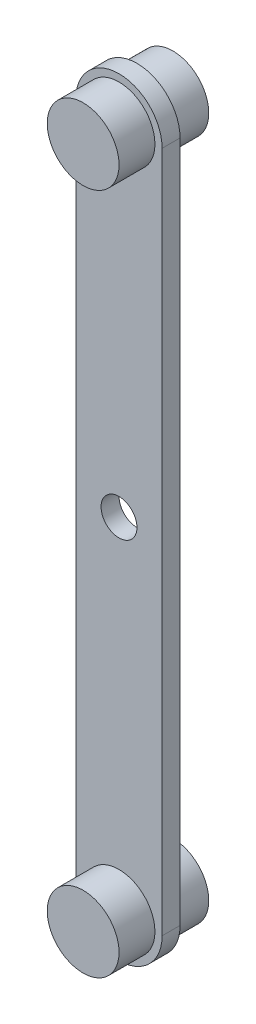
ISO-10303-21;
HEADER;
FILE_DESCRIPTION(('STEP AP214'),'2;1');
FILE_NAME('part.step','',(''),(''),'','','');
FILE_SCHEMA(('AUTOMOTIVE_DESIGN { 1 0 10303 214 1 1 1 1 }'));
ENDSEC;
DATA;
#1=APPLICATION_CONTEXT('core data for automotive mechanical design processes');
#2=APPLICATION_PROTOCOL_DEFINITION('international standard','automotive_design',2000,#1);
#3=PRODUCT_CONTEXT('',#1,'mechanical');
#4=PRODUCT('Part','Part','',(#3));
#5=PRODUCT_RELATED_PRODUCT_CATEGORY('part','',(#4));
#6=PRODUCT_DEFINITION_FORMATION('','',#4);
#7=PRODUCT_DEFINITION_CONTEXT('part definition',#1,'design');
#8=PRODUCT_DEFINITION('design','',#6,#7);
#9=PRODUCT_DEFINITION_SHAPE('','',#8);
#10=(LENGTH_UNIT() NAMED_UNIT(*) SI_UNIT(.MILLI.,.METRE.));
#11=(NAMED_UNIT(*) PLANE_ANGLE_UNIT() SI_UNIT($,.RADIAN.));
#12=(NAMED_UNIT(*) SI_UNIT($,.STERADIAN.) SOLID_ANGLE_UNIT());
#13=UNCERTAINTY_MEASURE_WITH_UNIT(LENGTH_MEASURE(1.E-05),#10,'distance_accuracy_value','');
#14=(GEOMETRIC_REPRESENTATION_CONTEXT(3) GLOBAL_UNCERTAINTY_ASSIGNED_CONTEXT((#13)) GLOBAL_UNIT_ASSIGNED_CONTEXT((#10,
#11,#12)) REPRESENTATION_CONTEXT('',''));
#15=CARTESIAN_POINT('',(0.,0.,0.));
#16=DIRECTION('',(0.,0.,1.));
#17=DIRECTION('',(1.,0.,0.));
#18=AXIS2_PLACEMENT_3D('',#15,#16,#17);
#19=CARTESIAN_POINT('',(0.,10.,5.));
#20=DIRECTION('',(0.,0.,-1.));
#21=DIRECTION('',(-1.,0.,0.));
#22=AXIS2_PLACEMENT_3D('',#19,#20,#21);
#23=CYLINDRICAL_SURFACE('',#22,10.);
#24=CARTESIAN_POINT('',(0.,10.,15.));
#25=DIRECTION('',(0.,0.,1.));
#26=DIRECTION('',(1.,0.,0.));
#27=AXIS2_PLACEMENT_3D('',#24,#25,#26);
#28=CIRCLE('',#27,10.);
#29=CARTESIAN_POINT('',(10.,10.,15.));
#30=VERTEX_POINT('',#29);
#31=EDGE_CURVE('E44',#30,#30,#28,.T.);
#32=ORIENTED_EDGE('',*,*,#31,.F.);
#33=EDGE_LOOP('',(#32));
#34=FACE_BOUND('',#33,.T.);
#35=CARTESIAN_POINT('',(0.,10.,5.));
#36=DIRECTION('',(0.,0.,1.));
#37=DIRECTION('',(1.,0.,0.));
#38=AXIS2_PLACEMENT_3D('',#35,#36,#37);
#39=CIRCLE('',#38,10.);
#40=CARTESIAN_POINT('',(10.,10.,5.));
#41=VERTEX_POINT('',#40);
#42=EDGE_CURVE('E138',#41,#41,#39,.T.);
#43=ORIENTED_EDGE('',*,*,#42,.T.);
#44=EDGE_LOOP('',(#43));
#45=FACE_BOUND('',#44,.T.);
#46=ADVANCED_FACE('F41',(#34,#45),#23,.T.);
#47=CARTESIAN_POINT('',(0.,200.,5.));
#48=DIRECTION('',(0.,0.,-1.));
#49=DIRECTION('',(-1.,0.,0.));
#50=AXIS2_PLACEMENT_3D('',#47,#48,#49);
#51=CYLINDRICAL_SURFACE('',#50,10.);
#52=CARTESIAN_POINT('',(0.,200.,15.));
#53=DIRECTION('',(0.,0.,1.));
#54=DIRECTION('',(1.,0.,0.));
#55=AXIS2_PLACEMENT_3D('',#52,#53,#54);
#56=CIRCLE('',#55,10.);
#57=CARTESIAN_POINT('',(10.,200.,15.));
#58=VERTEX_POINT('',#57);
#59=EDGE_CURVE('E132',#58,#58,#56,.T.);
#60=ORIENTED_EDGE('',*,*,#59,.F.);
#61=EDGE_LOOP('',(#60));
#62=FACE_BOUND('',#61,.T.);
#63=CARTESIAN_POINT('',(0.,200.,5.));
#64=DIRECTION('',(0.,0.,1.));
#65=DIRECTION('',(1.,0.,0.));
#66=AXIS2_PLACEMENT_3D('',#63,#64,#65);
#67=CIRCLE('',#66,10.);
#68=CARTESIAN_POINT('',(10.,200.,5.));
#69=VERTEX_POINT('',#68);
#70=EDGE_CURVE('E51',#69,#69,#67,.T.);
#71=ORIENTED_EDGE('',*,*,#70,.T.);
#72=EDGE_LOOP('',(#71));
#73=FACE_BOUND('',#72,.T.);
#74=ADVANCED_FACE('F150',(#62,#73),#51,.T.);
#75=CARTESIAN_POINT('',(0.,10.,5.));
#76=DIRECTION('',(0.,0.,-1.));
#77=DIRECTION('',(-1.,0.,0.));
#78=AXIS2_PLACEMENT_3D('',#75,#76,#77);
#79=PLANE('',#78);
#80=CARTESIAN_POINT('',(0.,105.,5.));
#81=DIRECTION('',(0.,0.,-1.));
#82=DIRECTION('',(-1.,0.,0.));
#83=AXIS2_PLACEMENT_3D('',#80,#81,#82);
#84=CIRCLE('',#83,5.);
#85=CARTESIAN_POINT('',(-5.,105.,5.));
#86=VERTEX_POINT('',#85);
#87=EDGE_CURVE('E116',#86,#86,#84,.T.);
#88=ORIENTED_EDGE('',*,*,#87,.T.);
#89=EDGE_LOOP('',(#88));
#90=FACE_BOUND('',#89,.T.);
#91=ORIENTED_EDGE('',*,*,#70,.F.);
#92=EDGE_LOOP('',(#91));
#93=FACE_BOUND('',#92,.T.);
#94=ORIENTED_EDGE('',*,*,#42,.F.);
#95=EDGE_LOOP('',(#94));
#96=FACE_BOUND('',#95,.T.);
#97=CARTESIAN_POINT('',(0.,200.,5.));
#98=DIRECTION('',(0.,0.,-1.));
#99=DIRECTION('',(-1.,0.,0.));
#100=AXIS2_PLACEMENT_3D('',#97,#98,#99);
#101=CIRCLE('',#100,12.);
#102=CARTESIAN_POINT('',(-12.,200.,5.));
#103=VERTEX_POINT('',#102);
#104=CARTESIAN_POINT('',(12.,200.,5.));
#105=VERTEX_POINT('',#104);
#106=EDGE_CURVE('E104',#103,#105,#101,.T.);
#107=ORIENTED_EDGE('',*,*,#106,.F.);
#108=DIRECTION('',(0.,1.,0.));
#109=VECTOR('',#108,1.);
#110=CARTESIAN_POINT('',(-12.,200.,5.));
#111=LINE('',#110,#109);
#112=CARTESIAN_POINT('',(-12.,10.,5.));
#113=VERTEX_POINT('',#112);
#114=EDGE_CURVE('E105',#113,#103,#111,.T.);
#115=ORIENTED_EDGE('',*,*,#114,.F.);
#116=CARTESIAN_POINT('',(0.,10.,5.));
#117=DIRECTION('',(0.,0.,-1.));
#118=DIRECTION('',(-1.,0.,0.));
#119=AXIS2_PLACEMENT_3D('',#116,#117,#118);
#120=CIRCLE('',#119,12.);
#121=CARTESIAN_POINT('',(12.,10.,5.));
#122=VERTEX_POINT('',#121);
#123=EDGE_CURVE('E94',#122,#113,#120,.T.);
#124=ORIENTED_EDGE('',*,*,#123,.F.);
#125=DIRECTION('',(0.,-1.,0.));
#126=VECTOR('',#125,1.);
#127=CARTESIAN_POINT('',(12.,10.,5.));
#128=LINE('',#127,#126);
#129=EDGE_CURVE('E101',#105,#122,#128,.T.);
#130=ORIENTED_EDGE('',*,*,#129,.F.);
#131=EDGE_LOOP('',(#107,#115,#124,#130));
#132=FACE_BOUND('',#131,.T.);
#133=ADVANCED_FACE('F99',(#90,#93,#96,#132),#79,.F.);
#134=CARTESIAN_POINT('',(0.,10.,15.));
#135=DIRECTION('',(0.,0.,1.));
#136=DIRECTION('',(1.,0.,0.));
#137=AXIS2_PLACEMENT_3D('',#134,#135,#136);
#138=PLANE('',#137);
#139=ORIENTED_EDGE('',*,*,#31,.T.);
#140=EDGE_LOOP('',(#139));
#141=FACE_BOUND('',#140,.T.);
#142=ADVANCED_FACE('F145',(#141),#138,.T.);
#143=CARTESIAN_POINT('',(0.,200.,15.));
#144=DIRECTION('',(0.,0.,1.));
#145=DIRECTION('',(1.,0.,0.));
#146=AXIS2_PLACEMENT_3D('',#143,#144,#145);
#147=PLANE('',#146);
#148=ORIENTED_EDGE('',*,*,#59,.T.);
#149=EDGE_LOOP('',(#148));
#150=FACE_BOUND('',#149,.T.);
#151=ADVANCED_FACE('F181',(#150),#147,.T.);
#152=CARTESIAN_POINT('',(0.,200.,5.));
#153=DIRECTION('',(0.,0.,-1.));
#154=DIRECTION('',(-1.,0.,0.));
#155=AXIS2_PLACEMENT_3D('',#152,#153,#154);
#156=CYLINDRICAL_SURFACE('',#155,12.);
#157=CARTESIAN_POINT('',(0.,200.,0.));
#158=DIRECTION('',(0.,0.,-1.));
#159=DIRECTION('',(-1.,0.,0.));
#160=AXIS2_PLACEMENT_3D('',#157,#158,#159);
#161=CIRCLE('',#160,12.);
#162=CARTESIAN_POINT('',(-12.,200.,0.));
#163=VERTEX_POINT('',#162);
#164=CARTESIAN_POINT('',(12.,200.,0.));
#165=VERTEX_POINT('',#164);
#166=EDGE_CURVE('E115',#163,#165,#161,.T.);
#167=ORIENTED_EDGE('',*,*,#166,.F.);
#168=DIRECTION('',(0.,0.,-1.));
#169=VECTOR('',#168,1.);
#170=CARTESIAN_POINT('',(-12.,200.,5.));
#171=LINE('',#170,#169);
#172=EDGE_CURVE('E58',#103,#163,#171,.T.);
#173=ORIENTED_EDGE('',*,*,#172,.F.);
#174=ORIENTED_EDGE('',*,*,#106,.T.);
#175=DIRECTION('',(0.,0.,-1.));
#176=VECTOR('',#175,1.);
#177=CARTESIAN_POINT('',(12.,200.,5.));
#178=LINE('',#177,#176);
#179=EDGE_CURVE('E86',#105,#165,#178,.T.);
#180=ORIENTED_EDGE('',*,*,#179,.T.);
#181=EDGE_LOOP('',(#167,#173,#174,#180));
#182=FACE_BOUND('',#181,.T.);
#183=ADVANCED_FACE('F183',(#182),#156,.T.);
#184=CARTESIAN_POINT('',(-12.,200.,5.));
#185=DIRECTION('',(-1.,0.,0.));
#186=DIRECTION('',(0.,-1.,0.));
#187=AXIS2_PLACEMENT_3D('',#184,#185,#186);
#188=PLANE('',#187);
#189=DIRECTION('',(0.,1.,0.));
#190=VECTOR('',#189,1.);
#191=CARTESIAN_POINT('',(-12.,200.,0.));
#192=LINE('',#191,#190);
#193=CARTESIAN_POINT('',(-12.,10.,0.));
#194=VERTEX_POINT('',#193);
#195=EDGE_CURVE('E110',#194,#163,#192,.T.);
#196=ORIENTED_EDGE('',*,*,#195,.F.);
#197=DIRECTION('',(0.,0.,-1.));
#198=VECTOR('',#197,1.);
#199=CARTESIAN_POINT('',(-12.,10.,5.));
#200=LINE('',#199,#198);
#201=EDGE_CURVE('E80',#113,#194,#200,.T.);
#202=ORIENTED_EDGE('',*,*,#201,.F.);
#203=ORIENTED_EDGE('',*,*,#114,.T.);
#204=ORIENTED_EDGE('',*,*,#172,.T.);
#205=EDGE_LOOP('',(#196,#202,#203,#204));
#206=FACE_BOUND('',#205,.T.);
#207=ADVANCED_FACE('F205',(#206),#188,.T.);
#208=CARTESIAN_POINT('',(0.,10.,5.));
#209=DIRECTION('',(0.,0.,-1.));
#210=DIRECTION('',(-1.,0.,0.));
#211=AXIS2_PLACEMENT_3D('',#208,#209,#210);
#212=CYLINDRICAL_SURFACE('',#211,12.);
#213=CARTESIAN_POINT('',(0.,10.,0.));
#214=DIRECTION('',(0.,0.,-1.));
#215=DIRECTION('',(-1.,0.,0.));
#216=AXIS2_PLACEMENT_3D('',#213,#214,#215);
#217=CIRCLE('',#216,12.);
#218=CARTESIAN_POINT('',(12.,10.,0.));
#219=VERTEX_POINT('',#218);
#220=EDGE_CURVE('E96',#219,#194,#217,.T.);
#221=ORIENTED_EDGE('',*,*,#220,.F.);
#222=DIRECTION('',(0.,0.,-1.));
#223=VECTOR('',#222,1.);
#224=CARTESIAN_POINT('',(12.,10.,5.));
#225=LINE('',#224,#223);
#226=EDGE_CURVE('E93',#122,#219,#225,.T.);
#227=ORIENTED_EDGE('',*,*,#226,.F.);
#228=ORIENTED_EDGE('',*,*,#123,.T.);
#229=ORIENTED_EDGE('',*,*,#201,.T.);
#230=EDGE_LOOP('',(#221,#227,#228,#229));
#231=FACE_BOUND('',#230,.T.);
#232=ADVANCED_FACE('F91',(#231),#212,.T.);
#233=CARTESIAN_POINT('',(12.,10.,5.));
#234=DIRECTION('',(1.,0.,0.));
#235=DIRECTION('',(0.,1.,0.));
#236=AXIS2_PLACEMENT_3D('',#233,#234,#235);
#237=PLANE('',#236);
#238=DIRECTION('',(0.,-1.,0.));
#239=VECTOR('',#238,1.);
#240=CARTESIAN_POINT('',(12.,10.,0.));
#241=LINE('',#240,#239);
#242=EDGE_CURVE('E113',#165,#219,#241,.T.);
#243=ORIENTED_EDGE('',*,*,#242,.F.);
#244=ORIENTED_EDGE('',*,*,#179,.F.);
#245=ORIENTED_EDGE('',*,*,#129,.T.);
#246=ORIENTED_EDGE('',*,*,#226,.T.);
#247=EDGE_LOOP('',(#243,#244,#245,#246));
#248=FACE_BOUND('',#247,.T.);
#249=ADVANCED_FACE('F102',(#248),#237,.T.);
#250=CARTESIAN_POINT('',(0.,10.,-10.));
#251=DIRECTION('',(0.,0.,-1.));
#252=DIRECTION('',(-1.,0.,0.));
#253=AXIS2_PLACEMENT_3D('',#250,#251,#252);
#254=PLANE('',#253);
#255=CARTESIAN_POINT('',(0.,10.,-10.));
#256=DIRECTION('',(0.,0.,-1.));
#257=DIRECTION('',(-1.,0.,0.));
#258=AXIS2_PLACEMENT_3D('',#255,#256,#257);
#259=CIRCLE('',#258,10.);
#260=CARTESIAN_POINT('',(-10.,10.,-10.));
#261=VERTEX_POINT('',#260);
#262=EDGE_CURVE('E125',#261,#261,#259,.T.);
#263=ORIENTED_EDGE('',*,*,#262,.T.);
#264=EDGE_LOOP('',(#263));
#265=FACE_BOUND('',#264,.T.);
#266=ADVANCED_FACE('F168',(#265),#254,.T.);
#267=CARTESIAN_POINT('',(0.,200.,-10.));
#268=DIRECTION('',(0.,0.,-1.));
#269=DIRECTION('',(-1.,0.,0.));
#270=AXIS2_PLACEMENT_3D('',#267,#268,#269);
#271=PLANE('',#270);
#272=CARTESIAN_POINT('',(0.,200.,-10.));
#273=DIRECTION('',(0.,0.,-1.));
#274=DIRECTION('',(-1.,0.,0.));
#275=AXIS2_PLACEMENT_3D('',#272,#273,#274);
#276=CIRCLE('',#275,10.);
#277=CARTESIAN_POINT('',(-10.,200.,-10.));
#278=VERTEX_POINT('',#277);
#279=EDGE_CURVE('E122',#278,#278,#276,.T.);
#280=ORIENTED_EDGE('',*,*,#279,.T.);
#281=EDGE_LOOP('',(#280));
#282=FACE_BOUND('',#281,.T.);
#283=ADVANCED_FACE('F175',(#282),#271,.T.);
#284=CARTESIAN_POINT('',(0.,10.,0.));
#285=DIRECTION('',(0.,0.,-1.));
#286=DIRECTION('',(-1.,0.,0.));
#287=AXIS2_PLACEMENT_3D('',#284,#285,#286);
#288=PLANE('',#287);
#289=CARTESIAN_POINT('',(0.,105.,0.));
#290=DIRECTION('',(0.,0.,-1.));
#291=DIRECTION('',(-1.,0.,0.));
#292=AXIS2_PLACEMENT_3D('',#289,#290,#291);
#293=CIRCLE('',#292,5.);
#294=CARTESIAN_POINT('',(-5.,105.,0.));
#295=VERTEX_POINT('',#294);
#296=EDGE_CURVE('E196',#295,#295,#293,.T.);
#297=ORIENTED_EDGE('',*,*,#296,.F.);
#298=EDGE_LOOP('',(#297));
#299=FACE_BOUND('',#298,.T.);
#300=CARTESIAN_POINT('',(0.,200.,0.));
#301=DIRECTION('',(0.,0.,-1.));
#302=DIRECTION('',(-1.,0.,0.));
#303=AXIS2_PLACEMENT_3D('',#300,#301,#302);
#304=CIRCLE('',#303,10.);
#305=CARTESIAN_POINT('',(-10.,200.,0.));
#306=VERTEX_POINT('',#305);
#307=EDGE_CURVE('E11',#306,#306,#304,.T.);
#308=ORIENTED_EDGE('',*,*,#307,.F.);
#309=EDGE_LOOP('',(#308));
#310=FACE_BOUND('',#309,.T.);
#311=CARTESIAN_POINT('',(0.,10.,0.));
#312=DIRECTION('',(0.,0.,-1.));
#313=DIRECTION('',(-1.,0.,0.));
#314=AXIS2_PLACEMENT_3D('',#311,#312,#313);
#315=CIRCLE('',#314,10.);
#316=CARTESIAN_POINT('',(-10.,10.,0.));
#317=VERTEX_POINT('',#316);
#318=EDGE_CURVE('E130',#317,#317,#315,.T.);
#319=ORIENTED_EDGE('',*,*,#318,.F.);
#320=EDGE_LOOP('',(#319));
#321=FACE_BOUND('',#320,.T.);
#322=ORIENTED_EDGE('',*,*,#166,.T.);
#323=ORIENTED_EDGE('',*,*,#242,.T.);
#324=ORIENTED_EDGE('',*,*,#220,.T.);
#325=ORIENTED_EDGE('',*,*,#195,.T.);
#326=EDGE_LOOP('',(#322,#323,#324,#325));
#327=FACE_BOUND('',#326,.T.);
#328=ADVANCED_FACE('F163',(#299,#310,#321,#327),#288,.T.);
#329=ORIENTED_EDGE('',*,*,#307,.T.);
#330=EDGE_LOOP('',(#329));
#331=FACE_BOUND('',#330,.T.);
#332=ORIENTED_EDGE('',*,*,#279,.F.);
#333=EDGE_LOOP('',(#332));
#334=FACE_BOUND('',#333,.T.);
#335=ADVANCED_FACE('F153',(#331,#334),#51,.T.);
#336=ORIENTED_EDGE('',*,*,#318,.T.);
#337=EDGE_LOOP('',(#336));
#338=FACE_BOUND('',#337,.T.);
#339=ORIENTED_EDGE('',*,*,#262,.F.);
#340=EDGE_LOOP('',(#339));
#341=FACE_BOUND('',#340,.T.);
#342=ADVANCED_FACE('F43',(#338,#341),#23,.T.);
#343=CARTESIAN_POINT('',(0.,105.,35.));
#344=DIRECTION('',(0.,0.,-1.));
#345=DIRECTION('',(-1.,0.,0.));
#346=AXIS2_PLACEMENT_3D('',#343,#344,#345);
#347=CYLINDRICAL_SURFACE('',#346,5.);
#348=ORIENTED_EDGE('',*,*,#296,.T.);
#349=EDGE_LOOP('',(#348));
#350=FACE_BOUND('',#349,.T.);
#351=ORIENTED_EDGE('',*,*,#87,.F.);
#352=EDGE_LOOP('',(#351));
#353=FACE_BOUND('',#352,.T.);
#354=ADVANCED_FACE('F154',(#350,#353),#347,.F.);
#355=CLOSED_SHELL('',(#46,#74,#133,#142,#151,#183,#207,#232,#249,#266,#283,#328,#335,#342,#354));
#356=MANIFOLD_SOLID_BREP('B2',#355);
#357=ADVANCED_BREP_SHAPE_REPRESENTATION('',(#18,#356),#14);
#358=SHAPE_DEFINITION_REPRESENTATION(#9,#357);
ENDSEC;
END-ISO-10303-21;
